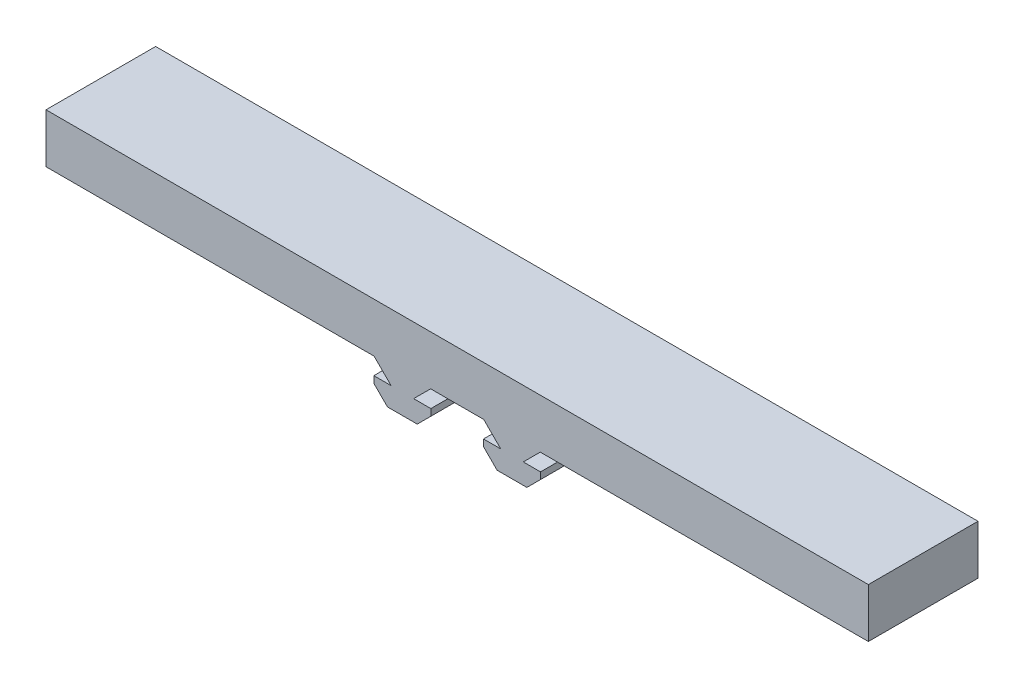
ISO-10303-21;
HEADER;
FILE_DESCRIPTION(('STEP AP214'),'2;1');
FILE_NAME('part.step','',(''),(''),'','','');
FILE_SCHEMA(('AUTOMOTIVE_DESIGN { 1 0 10303 214 1 1 1 1 }'));
ENDSEC;
DATA;
#1=APPLICATION_CONTEXT('core data for automotive mechanical design processes');
#2=APPLICATION_PROTOCOL_DEFINITION('international standard','automotive_design',2000,#1);
#3=PRODUCT_CONTEXT('',#1,'mechanical');
#4=PRODUCT('Part','Part','',(#3));
#5=PRODUCT_RELATED_PRODUCT_CATEGORY('part','',(#4));
#6=PRODUCT_DEFINITION_FORMATION('','',#4);
#7=PRODUCT_DEFINITION_CONTEXT('part definition',#1,'design');
#8=PRODUCT_DEFINITION('design','',#6,#7);
#9=PRODUCT_DEFINITION_SHAPE('','',#8);
#10=(LENGTH_UNIT() NAMED_UNIT(*) SI_UNIT(.MILLI.,.METRE.));
#11=(NAMED_UNIT(*) PLANE_ANGLE_UNIT() SI_UNIT($,.RADIAN.));
#12=(NAMED_UNIT(*) SI_UNIT($,.STERADIAN.) SOLID_ANGLE_UNIT());
#13=UNCERTAINTY_MEASURE_WITH_UNIT(LENGTH_MEASURE(1.E-05),#10,'distance_accuracy_value','');
#14=(GEOMETRIC_REPRESENTATION_CONTEXT(3) GLOBAL_UNCERTAINTY_ASSIGNED_CONTEXT((#13)) GLOBAL_UNIT_ASSIGNED_CONTEXT((#10,
#11,#12)) REPRESENTATION_CONTEXT('',''));
#15=CARTESIAN_POINT('',(0.,0.,0.));
#16=DIRECTION('',(0.,0.,1.));
#17=DIRECTION('',(1.,0.,0.));
#18=AXIS2_PLACEMENT_3D('',#15,#16,#17);
#19=CARTESIAN_POINT('',(-21.2929086217148,51.9989658510694,20.));
#20=DIRECTION('',(1.,0.,0.));
#21=DIRECTION('',(0.,0.,-1.));
#22=AXIS2_PLACEMENT_3D('',#19,#20,#21);
#23=PLANE('',#22);
#24=DIRECTION('',(0.,-1.,0.));
#25=VECTOR('',#24,1.);
#26=CARTESIAN_POINT('',(-21.2929086217148,51.9989658510694,0.));
#27=LINE('',#26,#25);
#28=CARTESIAN_POINT('',(-21.2929086217148,51.9989658510694,0.));
#29=VERTEX_POINT('',#28);
#30=CARTESIAN_POINT('',(-21.2929086217148,42.9989658510694,0.));
#31=VERTEX_POINT('',#30);
#32=EDGE_CURVE('E289',#29,#31,#27,.T.);
#33=ORIENTED_EDGE('',*,*,#32,.T.);
#34=DIRECTION('',(0.,0.,-1.));
#35=VECTOR('',#34,1.);
#36=CARTESIAN_POINT('',(-21.2929086217148,42.9989658510694,20.));
#37=LINE('',#36,#35);
#38=CARTESIAN_POINT('',(-21.2929086217148,42.9989658510694,20.));
#39=VERTEX_POINT('',#38);
#40=EDGE_CURVE('E12',#39,#31,#37,.T.);
#41=ORIENTED_EDGE('',*,*,#40,.F.);
#42=DIRECTION('',(0.,-1.,0.));
#43=VECTOR('',#42,1.);
#44=CARTESIAN_POINT('',(-21.2929086217148,51.9989658510694,20.));
#45=LINE('',#44,#43);
#46=CARTESIAN_POINT('',(-21.2929086217148,51.9989658510694,20.));
#47=VERTEX_POINT('',#46);
#48=EDGE_CURVE('E204',#47,#39,#45,.T.);
#49=ORIENTED_EDGE('',*,*,#48,.F.);
#50=DIRECTION('',(0.,0.,-1.));
#51=VECTOR('',#50,1.);
#52=CARTESIAN_POINT('',(-21.2929086217148,51.9989658510694,20.));
#53=LINE('',#52,#51);
#54=EDGE_CURVE('E306',#47,#29,#53,.T.);
#55=ORIENTED_EDGE('',*,*,#54,.T.);
#56=EDGE_LOOP('',(#33,#41,#49,#55));
#57=FACE_BOUND('',#56,.T.);
#58=ADVANCED_FACE('F41',(#57),#23,.F.);
#59=CARTESIAN_POINT('',(-21.2929086217148,42.9989658510694,20.));
#60=DIRECTION('',(0.,1.,0.));
#61=DIRECTION('',(0.,0.,1.));
#62=AXIS2_PLACEMENT_3D('',#59,#60,#61);
#63=PLANE('',#62);
#64=DIRECTION('',(1.,0.,0.));
#65=VECTOR('',#64,1.);
#66=CARTESIAN_POINT('',(-21.2929086217148,42.9989658510694,0.));
#67=LINE('',#66,#65);
#68=CARTESIAN_POINT('',(38.5513554469971,42.9989658510694,0.));
#69=VERTEX_POINT('',#68);
#70=EDGE_CURVE('E211',#31,#69,#67,.T.);
#71=ORIENTED_EDGE('',*,*,#70,.T.);
#72=DIRECTION('',(0.,0.,-1.));
#73=VECTOR('',#72,1.);
#74=CARTESIAN_POINT('',(38.5513554469971,42.9989658510694,20.));
#75=LINE('',#74,#73);
#76=CARTESIAN_POINT('',(38.5513554469971,42.9989658510694,20.));
#77=VERTEX_POINT('',#76);
#78=EDGE_CURVE('E45',#77,#69,#75,.T.);
#79=ORIENTED_EDGE('',*,*,#78,.F.);
#80=DIRECTION('',(1.,0.,0.));
#81=VECTOR('',#80,1.);
#82=CARTESIAN_POINT('',(-21.2929086217148,42.9989658510694,20.));
#83=LINE('',#82,#81);
#84=EDGE_CURVE('E197',#39,#77,#83,.T.);
#85=ORIENTED_EDGE('',*,*,#84,.F.);
#86=ORIENTED_EDGE('',*,*,#40,.T.);
#87=EDGE_LOOP('',(#71,#79,#85,#86));
#88=FACE_BOUND('',#87,.T.);
#89=ADVANCED_FACE('F210',(#88),#63,.F.);
#90=CARTESIAN_POINT('',(39.3392234126411,42.2110978854254,20.));
#91=DIRECTION('',(0.707106781186538,0.707106781186557,0.));
#92=DIRECTION('',(-0.707106781186557,0.707106781186538,0.));
#93=AXIS2_PLACEMENT_3D('',#90,#91,#92);
#94=PLANE('',#93);
#95=DIRECTION('',(0.707106781186557,-0.707106781186538,0.));
#96=VECTOR('',#95,1.);
#97=CARTESIAN_POINT('',(39.3392234126411,42.2110978854254,0.));
#98=LINE('',#97,#96);
#99=CARTESIAN_POINT('',(41.6513554469972,39.8989658510694,0.));
#100=VERTEX_POINT('',#99);
#101=EDGE_CURVE('E226',#69,#100,#98,.T.);
#102=ORIENTED_EDGE('',*,*,#101,.T.);
#103=DIRECTION('',(0.,0.,-1.));
#104=VECTOR('',#103,1.);
#105=CARTESIAN_POINT('',(41.6513554469972,39.8989658510694,20.));
#106=LINE('',#105,#104);
#107=CARTESIAN_POINT('',(41.6513554469972,39.8989658510694,20.));
#108=VERTEX_POINT('',#107);
#109=EDGE_CURVE('E215',#108,#100,#106,.T.);
#110=ORIENTED_EDGE('',*,*,#109,.F.);
#111=DIRECTION('',(0.707106781186557,-0.707106781186538,0.));
#112=VECTOR('',#111,1.);
#113=CARTESIAN_POINT('',(39.3392234126411,42.2110978854254,20.));
#114=LINE('',#113,#112);
#115=EDGE_CURVE('E201',#77,#108,#114,.T.);
#116=ORIENTED_EDGE('',*,*,#115,.F.);
#117=ORIENTED_EDGE('',*,*,#78,.T.);
#118=EDGE_LOOP('',(#102,#110,#116,#117));
#119=FACE_BOUND('',#118,.T.);
#120=ADVANCED_FACE('F216',(#119),#94,.F.);
#121=CARTESIAN_POINT('',(40.9270913782852,39.8989658510694,20.));
#122=DIRECTION('',(0.,-1.,0.));
#123=DIRECTION('',(0.,0.,-1.));
#124=AXIS2_PLACEMENT_3D('',#121,#122,#123);
#125=PLANE('',#124);
#126=DIRECTION('',(-1.,0.,0.));
#127=VECTOR('',#126,1.);
#128=CARTESIAN_POINT('',(40.9270913782852,39.8989658510694,0.));
#129=LINE('',#128,#127);
#130=CARTESIAN_POINT('',(38.5070913782852,39.8989658510694,0.));
#131=VERTEX_POINT('',#130);
#132=EDGE_CURVE('E292',#100,#131,#129,.T.);
#133=ORIENTED_EDGE('',*,*,#132,.T.);
#134=DIRECTION('',(0.,0.,-1.));
#135=VECTOR('',#134,1.);
#136=CARTESIAN_POINT('',(38.5070913782852,39.8989658510694,20.));
#137=LINE('',#136,#135);
#138=CARTESIAN_POINT('',(38.5070913782852,39.8989658510694,20.));
#139=VERTEX_POINT('',#138);
#140=EDGE_CURVE('E415',#139,#131,#137,.T.);
#141=ORIENTED_EDGE('',*,*,#140,.F.);
#142=DIRECTION('',(-1.,0.,0.));
#143=VECTOR('',#142,1.);
#144=CARTESIAN_POINT('',(40.9270913782852,39.8989658510694,20.));
#145=LINE('',#144,#143);
#146=EDGE_CURVE('E220',#108,#139,#145,.T.);
#147=ORIENTED_EDGE('',*,*,#146,.F.);
#148=ORIENTED_EDGE('',*,*,#109,.T.);
#149=EDGE_LOOP('',(#133,#141,#147,#148));
#150=FACE_BOUND('',#149,.T.);
#151=ADVANCED_FACE('F444',(#150),#125,.F.);
#152=CARTESIAN_POINT('',(38.5070913782852,40.1989658510694,20.));
#153=DIRECTION('',(1.,0.,0.));
#154=DIRECTION('',(0.,0.,-1.));
#155=AXIS2_PLACEMENT_3D('',#152,#153,#154);
#156=PLANE('',#155);
#157=DIRECTION('',(0.,-1.,0.));
#158=VECTOR('',#157,1.);
#159=CARTESIAN_POINT('',(38.5070913782852,40.1989658510694,0.));
#160=LINE('',#159,#158);
#161=CARTESIAN_POINT('',(38.5070913782852,38.6832299197814,0.));
#162=VERTEX_POINT('',#161);
#163=EDGE_CURVE('E438',#131,#162,#160,.T.);
#164=ORIENTED_EDGE('',*,*,#163,.T.);
#165=DIRECTION('',(0.,0.,-1.));
#166=VECTOR('',#165,1.);
#167=CARTESIAN_POINT('',(38.5070913782852,38.6832299197814,20.));
#168=LINE('',#167,#166);
#169=CARTESIAN_POINT('',(38.5070913782852,38.6832299197814,20.));
#170=VERTEX_POINT('',#169);
#171=EDGE_CURVE('E411',#170,#162,#168,.T.);
#172=ORIENTED_EDGE('',*,*,#171,.F.);
#173=DIRECTION('',(0.,-1.,0.));
#174=VECTOR('',#173,1.);
#175=CARTESIAN_POINT('',(38.5070913782852,40.1989658510694,20.));
#176=LINE('',#175,#174);
#177=EDGE_CURVE('E223',#139,#170,#176,.T.);
#178=ORIENTED_EDGE('',*,*,#177,.F.);
#179=ORIENTED_EDGE('',*,*,#140,.T.);
#180=EDGE_LOOP('',(#164,#172,#178,#179));
#181=FACE_BOUND('',#180,.T.);
#182=ADVANCED_FACE('F449',(#181),#156,.F.);
#183=CARTESIAN_POINT('',(38.4192234126411,38.7710978854254,20.));
#184=DIRECTION('',(0.707106781186538,0.707106781186557,0.));
#185=DIRECTION('',(-0.707106781186557,0.707106781186538,0.));
#186=AXIS2_PLACEMENT_3D('',#183,#184,#185);
#187=PLANE('',#186);
#188=DIRECTION('',(0.707106781186557,-0.707106781186538,0.));
#189=VECTOR('',#188,1.);
#190=CARTESIAN_POINT('',(38.4192234126411,38.7710978854254,0.));
#191=LINE('',#190,#189);
#192=CARTESIAN_POINT('',(40.9913554469971,36.1989658510694,0.));
#193=VERTEX_POINT('',#192);
#194=EDGE_CURVE('E435',#162,#193,#191,.T.);
#195=ORIENTED_EDGE('',*,*,#194,.T.);
#196=DIRECTION('',(0.,0.,-1.));
#197=VECTOR('',#196,1.);
#198=CARTESIAN_POINT('',(40.9913554469971,36.1989658510694,20.));
#199=LINE('',#198,#197);
#200=CARTESIAN_POINT('',(40.9913554469971,36.1989658510694,20.));
#201=VERTEX_POINT('',#200);
#202=EDGE_CURVE('E407',#201,#193,#199,.T.);
#203=ORIENTED_EDGE('',*,*,#202,.F.);
#204=DIRECTION('',(0.707106781186557,-0.707106781186538,0.));
#205=VECTOR('',#204,1.);
#206=CARTESIAN_POINT('',(38.4192234126411,38.7710978854254,20.));
#207=LINE('',#206,#205);
#208=EDGE_CURVE('E231',#170,#201,#207,.T.);
#209=ORIENTED_EDGE('',*,*,#208,.F.);
#210=ORIENTED_EDGE('',*,*,#171,.T.);
#211=EDGE_LOOP('',(#195,#203,#209,#210));
#212=FACE_BOUND('',#211,.T.);
#213=ADVANCED_FACE('F457',(#212),#187,.F.);
#214=CARTESIAN_POINT('',(40.8670913782852,36.1989658510694,20.));
#215=DIRECTION('',(0.,1.,0.));
#216=DIRECTION('',(0.,0.,1.));
#217=AXIS2_PLACEMENT_3D('',#214,#215,#216);
#218=PLANE('',#217);
#219=DIRECTION('',(1.,0.,0.));
#220=VECTOR('',#219,1.);
#221=CARTESIAN_POINT('',(40.8670913782852,36.1989658510694,0.));
#222=LINE('',#221,#220);
#223=CARTESIAN_POINT('',(46.4228273095732,36.1989658510694,0.));
#224=VERTEX_POINT('',#223);
#225=EDGE_CURVE('E432',#193,#224,#222,.T.);
#226=ORIENTED_EDGE('',*,*,#225,.T.);
#227=DIRECTION('',(0.,0.,-1.));
#228=VECTOR('',#227,1.);
#229=CARTESIAN_POINT('',(46.4228273095732,36.1989658510694,20.));
#230=LINE('',#229,#228);
#231=CARTESIAN_POINT('',(46.4228273095732,36.1989658510694,20.));
#232=VERTEX_POINT('',#231);
#233=EDGE_CURVE('E403',#232,#224,#230,.T.);
#234=ORIENTED_EDGE('',*,*,#233,.F.);
#235=DIRECTION('',(1.,0.,0.));
#236=VECTOR('',#235,1.);
#237=CARTESIAN_POINT('',(40.8670913782852,36.1989658510694,20.));
#238=LINE('',#237,#236);
#239=EDGE_CURVE('E234',#201,#232,#238,.T.);
#240=ORIENTED_EDGE('',*,*,#239,.F.);
#241=ORIENTED_EDGE('',*,*,#202,.T.);
#242=EDGE_LOOP('',(#226,#234,#240,#241));
#243=FACE_BOUND('',#242,.T.);
#244=ADVANCED_FACE('F461',(#243),#218,.F.);
#245=CARTESIAN_POINT('',(48.9949593439292,38.7710978854254,20.));
#246=DIRECTION('',(-0.707106781186539,0.707106781186556,0.));
#247=DIRECTION('',(-0.707106781186556,-0.707106781186539,0.));
#248=AXIS2_PLACEMENT_3D('',#245,#246,#247);
#249=PLANE('',#248);
#250=DIRECTION('',(0.707106781186556,0.707106781186539,0.));
#251=VECTOR('',#250,1.);
#252=CARTESIAN_POINT('',(48.9949593439292,38.7710978854254,0.));
#253=LINE('',#252,#251);
#254=CARTESIAN_POINT('',(48.9070913782852,38.6832299197814,0.));
#255=VERTEX_POINT('',#254);
#256=EDGE_CURVE('E429',#224,#255,#253,.T.);
#257=ORIENTED_EDGE('',*,*,#256,.T.);
#258=DIRECTION('',(0.,0.,-1.));
#259=VECTOR('',#258,1.);
#260=CARTESIAN_POINT('',(48.9070913782852,38.6832299197814,20.));
#261=LINE('',#260,#259);
#262=CARTESIAN_POINT('',(48.9070913782852,38.6832299197814,20.));
#263=VERTEX_POINT('',#262);
#264=EDGE_CURVE('E399',#263,#255,#261,.T.);
#265=ORIENTED_EDGE('',*,*,#264,.F.);
#266=DIRECTION('',(0.707106781186556,0.707106781186539,0.));
#267=VECTOR('',#266,1.);
#268=CARTESIAN_POINT('',(48.9949593439292,38.7710978854254,20.));
#269=LINE('',#268,#267);
#270=EDGE_CURVE('E237',#232,#263,#269,.T.);
#271=ORIENTED_EDGE('',*,*,#270,.F.);
#272=ORIENTED_EDGE('',*,*,#233,.T.);
#273=EDGE_LOOP('',(#257,#265,#271,#272));
#274=FACE_BOUND('',#273,.T.);
#275=ADVANCED_FACE('F468',(#274),#249,.F.);
#276=CARTESIAN_POINT('',(48.9070913782852,40.1989658510694,20.));
#277=DIRECTION('',(-1.,0.,0.));
#278=DIRECTION('',(0.,0.,1.));
#279=AXIS2_PLACEMENT_3D('',#276,#277,#278);
#280=PLANE('',#279);
#281=DIRECTION('',(0.,1.,0.));
#282=VECTOR('',#281,1.);
#283=CARTESIAN_POINT('',(48.9070913782852,40.1989658510694,0.));
#284=LINE('',#283,#282);
#285=CARTESIAN_POINT('',(48.9070913782852,39.8989658510694,0.));
#286=VERTEX_POINT('',#285);
#287=EDGE_CURVE('E426',#255,#286,#284,.T.);
#288=ORIENTED_EDGE('',*,*,#287,.T.);
#289=DIRECTION('',(0.,0.,-1.));
#290=VECTOR('',#289,1.);
#291=CARTESIAN_POINT('',(48.9070913782852,39.8989658510694,20.));
#292=LINE('',#291,#290);
#293=CARTESIAN_POINT('',(48.9070913782852,39.8989658510694,20.));
#294=VERTEX_POINT('',#293);
#295=EDGE_CURVE('E395',#294,#286,#292,.T.);
#296=ORIENTED_EDGE('',*,*,#295,.F.);
#297=DIRECTION('',(0.,1.,0.));
#298=VECTOR('',#297,1.);
#299=CARTESIAN_POINT('',(48.9070913782852,40.1989658510694,20.));
#300=LINE('',#299,#298);
#301=EDGE_CURVE('E240',#263,#294,#300,.T.);
#302=ORIENTED_EDGE('',*,*,#301,.F.);
#303=ORIENTED_EDGE('',*,*,#264,.T.);
#304=EDGE_LOOP('',(#288,#296,#302,#303));
#305=FACE_BOUND('',#304,.T.);
#306=ADVANCED_FACE('F471',(#305),#280,.F.);
#307=CARTESIAN_POINT('',(46.4870913782851,39.8989658510694,20.));
#308=DIRECTION('',(0.,-1.,0.));
#309=DIRECTION('',(1.,0.,0.));
#310=AXIS2_PLACEMENT_3D('',#307,#308,#309);
#311=PLANE('',#310);
#312=DIRECTION('',(-1.,0.,0.));
#313=VECTOR('',#312,1.);
#314=CARTESIAN_POINT('',(46.4870913782851,39.8989658510694,0.));
#315=LINE('',#314,#313);
#316=CARTESIAN_POINT('',(45.7628273095732,39.8989658510694,0.));
#317=VERTEX_POINT('',#316);
#318=EDGE_CURVE('E423',#286,#317,#315,.T.);
#319=ORIENTED_EDGE('',*,*,#318,.T.);
#320=DIRECTION('',(0.,0.,-1.));
#321=VECTOR('',#320,1.);
#322=CARTESIAN_POINT('',(45.7628273095732,39.8989658510694,20.));
#323=LINE('',#322,#321);
#324=CARTESIAN_POINT('',(45.7628273095732,39.8989658510694,20.));
#325=VERTEX_POINT('',#324);
#326=EDGE_CURVE('E259',#325,#317,#323,.T.);
#327=ORIENTED_EDGE('',*,*,#326,.F.);
#328=DIRECTION('',(-1.,0.,0.));
#329=VECTOR('',#328,1.);
#330=CARTESIAN_POINT('',(46.4870913782851,39.8989658510694,20.));
#331=LINE('',#330,#329);
#332=EDGE_CURVE('E243',#294,#325,#331,.T.);
#333=ORIENTED_EDGE('',*,*,#332,.F.);
#334=ORIENTED_EDGE('',*,*,#295,.T.);
#335=EDGE_LOOP('',(#319,#327,#333,#334));
#336=FACE_BOUND('',#335,.T.);
#337=ADVANCED_FACE('F476',(#336),#311,.F.);
#338=CARTESIAN_POINT('',(48.0749593439292,42.2110978854254,20.));
#339=DIRECTION('',(-0.707106781186539,0.707106781186556,0.));
#340=DIRECTION('',(-0.707106781186556,-0.707106781186539,0.));
#341=AXIS2_PLACEMENT_3D('',#338,#339,#340);
#342=PLANE('',#341);
#343=DIRECTION('',(0.707106781186556,0.707106781186539,0.));
#344=VECTOR('',#343,1.);
#345=CARTESIAN_POINT('',(48.0749593439292,42.2110978854254,0.));
#346=LINE('',#345,#344);
#347=CARTESIAN_POINT('',(48.8628273095733,42.9989658510694,0.));
#348=VERTEX_POINT('',#347);
#349=EDGE_CURVE('E254',#317,#348,#346,.T.);
#350=ORIENTED_EDGE('',*,*,#349,.T.);
#351=DIRECTION('',(0.,0.,-1.));
#352=VECTOR('',#351,1.);
#353=CARTESIAN_POINT('',(48.8628273095733,42.9989658510694,20.));
#354=LINE('',#353,#352);
#355=CARTESIAN_POINT('',(48.8628273095733,42.9989658510694,20.));
#356=VERTEX_POINT('',#355);
#357=EDGE_CURVE('E255',#356,#348,#354,.T.);
#358=ORIENTED_EDGE('',*,*,#357,.F.);
#359=DIRECTION('',(0.707106781186556,0.707106781186539,0.));
#360=VECTOR('',#359,1.);
#361=CARTESIAN_POINT('',(48.0749593439292,42.2110978854254,20.));
#362=LINE('',#361,#360);
#363=EDGE_CURVE('E246',#325,#356,#362,.T.);
#364=ORIENTED_EDGE('',*,*,#363,.F.);
#365=ORIENTED_EDGE('',*,*,#326,.T.);
#366=EDGE_LOOP('',(#350,#358,#364,#365));
#367=FACE_BOUND('',#366,.T.);
#368=ADVANCED_FACE('F482',(#367),#342,.F.);
#369=CARTESIAN_POINT('',(48.2870913782852,42.9989658510694,20.));
#370=DIRECTION('',(0.,1.,0.));
#371=DIRECTION('',(0.,0.,1.));
#372=AXIS2_PLACEMENT_3D('',#369,#370,#371);
#373=PLANE('',#372);
#374=DIRECTION('',(1.,0.,0.));
#375=VECTOR('',#374,1.);
#376=CARTESIAN_POINT('',(48.2870913782852,42.9989658510694,0.));
#377=LINE('',#376,#375);
#378=CARTESIAN_POINT('',(58.5513554469971,42.9989658510694,0.));
#379=VERTEX_POINT('',#378);
#380=EDGE_CURVE('E250',#348,#379,#377,.T.);
#381=ORIENTED_EDGE('',*,*,#380,.T.);
#382=DIRECTION('',(0.,0.,-1.));
#383=VECTOR('',#382,1.);
#384=CARTESIAN_POINT('',(58.5513554469971,42.9989658510694,20.));
#385=LINE('',#384,#383);
#386=CARTESIAN_POINT('',(58.5513554469971,42.9989658510694,20.));
#387=VERTEX_POINT('',#386);
#388=EDGE_CURVE('E260',#387,#379,#385,.T.);
#389=ORIENTED_EDGE('',*,*,#388,.F.);
#390=DIRECTION('',(1.,0.,0.));
#391=VECTOR('',#390,1.);
#392=CARTESIAN_POINT('',(48.2870913782852,42.9989658510694,20.));
#393=LINE('',#392,#391);
#394=EDGE_CURVE('E249',#356,#387,#393,.T.);
#395=ORIENTED_EDGE('',*,*,#394,.F.);
#396=ORIENTED_EDGE('',*,*,#357,.T.);
#397=EDGE_LOOP('',(#381,#389,#395,#396));
#398=FACE_BOUND('',#397,.T.);
#399=ADVANCED_FACE('F486',(#398),#373,.F.);
#400=CARTESIAN_POINT('',(59.3392234126411,42.2110978854254,20.));
#401=DIRECTION('',(0.707106781186539,0.707106781186556,0.));
#402=DIRECTION('',(-0.707106781186556,0.707106781186539,0.));
#403=AXIS2_PLACEMENT_3D('',#400,#401,#402);
#404=PLANE('',#403);
#405=DIRECTION('',(0.707106781186556,-0.707106781186539,0.));
#406=VECTOR('',#405,1.);
#407=CARTESIAN_POINT('',(59.3392234126411,42.2110978854254,0.));
#408=LINE('',#407,#406);
#409=CARTESIAN_POINT('',(61.6513554469972,39.8989658510694,0.));
#410=VERTEX_POINT('',#409);
#411=EDGE_CURVE('E253',#379,#410,#408,.T.);
#412=ORIENTED_EDGE('',*,*,#411,.T.);
#413=DIRECTION('',(0.,0.,-1.));
#414=VECTOR('',#413,1.);
#415=CARTESIAN_POINT('',(61.6513554469972,39.8989658510694,20.));
#416=LINE('',#415,#414);
#417=CARTESIAN_POINT('',(61.6513554469972,39.8989658510694,20.));
#418=VERTEX_POINT('',#417);
#419=EDGE_CURVE('E267',#418,#410,#416,.T.);
#420=ORIENTED_EDGE('',*,*,#419,.F.);
#421=DIRECTION('',(0.707106781186556,-0.707106781186539,0.));
#422=VECTOR('',#421,1.);
#423=CARTESIAN_POINT('',(59.3392234126411,42.2110978854254,20.));
#424=LINE('',#423,#422);
#425=EDGE_CURVE('E263',#387,#418,#424,.T.);
#426=ORIENTED_EDGE('',*,*,#425,.F.);
#427=ORIENTED_EDGE('',*,*,#388,.T.);
#428=EDGE_LOOP('',(#412,#420,#426,#427));
#429=FACE_BOUND('',#428,.T.);
#430=ADVANCED_FACE('F491',(#429),#404,.F.);
#431=CARTESIAN_POINT('',(60.9270913782852,39.8989658510694,20.));
#432=DIRECTION('',(0.,-1.,0.));
#433=DIRECTION('',(1.,0.,0.));
#434=AXIS2_PLACEMENT_3D('',#431,#432,#433);
#435=PLANE('',#434);
#436=DIRECTION('',(-1.,0.,0.));
#437=VECTOR('',#436,1.);
#438=CARTESIAN_POINT('',(60.9270913782852,39.8989658510694,0.));
#439=LINE('',#438,#437);
#440=CARTESIAN_POINT('',(58.5070913782852,39.8989658510694,0.));
#441=VERTEX_POINT('',#440);
#442=EDGE_CURVE('E360',#410,#441,#439,.T.);
#443=ORIENTED_EDGE('',*,*,#442,.T.);
#444=DIRECTION('',(0.,0.,-1.));
#445=VECTOR('',#444,1.);
#446=CARTESIAN_POINT('',(58.5070913782852,39.8989658510694,20.));
#447=LINE('',#446,#445);
#448=CARTESIAN_POINT('',(58.5070913782852,39.8989658510694,20.));
#449=VERTEX_POINT('',#448);
#450=EDGE_CURVE('E335',#449,#441,#447,.T.);
#451=ORIENTED_EDGE('',*,*,#450,.F.);
#452=DIRECTION('',(-1.,0.,0.));
#453=VECTOR('',#452,1.);
#454=CARTESIAN_POINT('',(60.9270913782852,39.8989658510694,20.));
#455=LINE('',#454,#453);
#456=EDGE_CURVE('E367',#418,#449,#455,.T.);
#457=ORIENTED_EDGE('',*,*,#456,.F.);
#458=ORIENTED_EDGE('',*,*,#419,.T.);
#459=EDGE_LOOP('',(#443,#451,#457,#458));
#460=FACE_BOUND('',#459,.T.);
#461=ADVANCED_FACE('F497',(#460),#435,.F.);
#462=CARTESIAN_POINT('',(58.5070913782852,40.1989658510694,20.));
#463=DIRECTION('',(1.,0.,0.));
#464=DIRECTION('',(0.,0.,-1.));
#465=AXIS2_PLACEMENT_3D('',#462,#463,#464);
#466=PLANE('',#465);
#467=DIRECTION('',(0.,-1.,0.));
#468=VECTOR('',#467,1.);
#469=CARTESIAN_POINT('',(58.5070913782852,40.1989658510694,0.));
#470=LINE('',#469,#468);
#471=CARTESIAN_POINT('',(58.5070913782852,38.6832299197814,0.));
#472=VERTEX_POINT('',#471);
#473=EDGE_CURVE('E357',#441,#472,#470,.T.);
#474=ORIENTED_EDGE('',*,*,#473,.T.);
#475=DIRECTION('',(0.,0.,-1.));
#476=VECTOR('',#475,1.);
#477=CARTESIAN_POINT('',(58.5070913782852,38.6832299197814,20.));
#478=LINE('',#477,#476);
#479=CARTESIAN_POINT('',(58.5070913782852,38.6832299197814,20.));
#480=VERTEX_POINT('',#479);
#481=EDGE_CURVE('E331',#480,#472,#478,.T.);
#482=ORIENTED_EDGE('',*,*,#481,.F.);
#483=DIRECTION('',(0.,-1.,0.));
#484=VECTOR('',#483,1.);
#485=CARTESIAN_POINT('',(58.5070913782852,40.1989658510694,20.));
#486=LINE('',#485,#484);
#487=EDGE_CURVE('E370',#449,#480,#486,.T.);
#488=ORIENTED_EDGE('',*,*,#487,.F.);
#489=ORIENTED_EDGE('',*,*,#450,.T.);
#490=EDGE_LOOP('',(#474,#482,#488,#489));
#491=FACE_BOUND('',#490,.T.);
#492=ADVANCED_FACE('F501',(#491),#466,.F.);
#493=CARTESIAN_POINT('',(58.4192234126411,38.7710978854254,20.));
#494=DIRECTION('',(0.707106781186539,0.707106781186556,0.));
#495=DIRECTION('',(-0.707106781186556,0.707106781186539,0.));
#496=AXIS2_PLACEMENT_3D('',#493,#494,#495);
#497=PLANE('',#496);
#498=DIRECTION('',(0.707106781186556,-0.707106781186539,0.));
#499=VECTOR('',#498,1.);
#500=CARTESIAN_POINT('',(58.4192234126411,38.7710978854254,0.));
#501=LINE('',#500,#499);
#502=CARTESIAN_POINT('',(60.9913554469972,36.1989658510694,0.));
#503=VERTEX_POINT('',#502);
#504=EDGE_CURVE('E354',#472,#503,#501,.T.);
#505=ORIENTED_EDGE('',*,*,#504,.T.);
#506=DIRECTION('',(0.,0.,-1.));
#507=VECTOR('',#506,1.);
#508=CARTESIAN_POINT('',(60.9913554469972,36.1989658510694,20.));
#509=LINE('',#508,#507);
#510=CARTESIAN_POINT('',(60.9913554469972,36.1989658510694,20.));
#511=VERTEX_POINT('',#510);
#512=EDGE_CURVE('E327',#511,#503,#509,.T.);
#513=ORIENTED_EDGE('',*,*,#512,.F.);
#514=DIRECTION('',(0.707106781186556,-0.707106781186539,0.));
#515=VECTOR('',#514,1.);
#516=CARTESIAN_POINT('',(58.4192234126411,38.7710978854254,20.));
#517=LINE('',#516,#515);
#518=EDGE_CURVE('E373',#480,#511,#517,.T.);
#519=ORIENTED_EDGE('',*,*,#518,.F.);
#520=ORIENTED_EDGE('',*,*,#481,.T.);
#521=EDGE_LOOP('',(#505,#513,#519,#520));
#522=FACE_BOUND('',#521,.T.);
#523=ADVANCED_FACE('F506',(#522),#497,.F.);
#524=CARTESIAN_POINT('',(66.5470913782851,36.1989658510694,20.));
#525=DIRECTION('',(0.,1.,0.));
#526=DIRECTION('',(0.,0.,1.));
#527=AXIS2_PLACEMENT_3D('',#524,#525,#526);
#528=PLANE('',#527);
#529=DIRECTION('',(1.,0.,0.));
#530=VECTOR('',#529,1.);
#531=CARTESIAN_POINT('',(66.5470913782851,36.1989658510694,0.));
#532=LINE('',#531,#530);
#533=CARTESIAN_POINT('',(66.4228273095732,36.1989658510694,0.));
#534=VERTEX_POINT('',#533);
#535=EDGE_CURVE('E351',#503,#534,#532,.T.);
#536=ORIENTED_EDGE('',*,*,#535,.T.);
#537=DIRECTION('',(0.,0.,-1.));
#538=VECTOR('',#537,1.);
#539=CARTESIAN_POINT('',(66.4228273095732,36.1989658510694,20.));
#540=LINE('',#539,#538);
#541=CARTESIAN_POINT('',(66.4228273095732,36.1989658510694,20.));
#542=VERTEX_POINT('',#541);
#543=EDGE_CURVE('E323',#542,#534,#540,.T.);
#544=ORIENTED_EDGE('',*,*,#543,.F.);
#545=DIRECTION('',(1.,0.,0.));
#546=VECTOR('',#545,1.);
#547=CARTESIAN_POINT('',(66.5470913782851,36.1989658510694,20.));
#548=LINE('',#547,#546);
#549=EDGE_CURVE('E376',#511,#542,#548,.T.);
#550=ORIENTED_EDGE('',*,*,#549,.F.);
#551=ORIENTED_EDGE('',*,*,#512,.T.);
#552=EDGE_LOOP('',(#536,#544,#550,#551));
#553=FACE_BOUND('',#552,.T.);
#554=ADVANCED_FACE('F512',(#553),#528,.F.);
#555=CARTESIAN_POINT('',(68.9949593439292,38.7710978854254,20.));
#556=DIRECTION('',(-0.707106781186539,0.707106781186556,0.));
#557=DIRECTION('',(-0.707106781186556,-0.707106781186539,0.));
#558=AXIS2_PLACEMENT_3D('',#555,#556,#557);
#559=PLANE('',#558);
#560=DIRECTION('',(0.707106781186556,0.707106781186539,0.));
#561=VECTOR('',#560,1.);
#562=CARTESIAN_POINT('',(68.9949593439292,38.7710978854254,0.));
#563=LINE('',#562,#561);
#564=CARTESIAN_POINT('',(68.9070913782852,38.6832299197814,0.));
#565=VERTEX_POINT('',#564);
#566=EDGE_CURVE('E348',#534,#565,#563,.T.);
#567=ORIENTED_EDGE('',*,*,#566,.T.);
#568=DIRECTION('',(0.,0.,-1.));
#569=VECTOR('',#568,1.);
#570=CARTESIAN_POINT('',(68.9070913782852,38.6832299197814,20.));
#571=LINE('',#570,#569);
#572=CARTESIAN_POINT('',(68.9070913782852,38.6832299197814,20.));
#573=VERTEX_POINT('',#572);
#574=EDGE_CURVE('E319',#573,#565,#571,.T.);
#575=ORIENTED_EDGE('',*,*,#574,.F.);
#576=DIRECTION('',(0.707106781186556,0.707106781186539,0.));
#577=VECTOR('',#576,1.);
#578=CARTESIAN_POINT('',(68.9949593439292,38.7710978854254,20.));
#579=LINE('',#578,#577);
#580=EDGE_CURVE('E379',#542,#573,#579,.T.);
#581=ORIENTED_EDGE('',*,*,#580,.F.);
#582=ORIENTED_EDGE('',*,*,#543,.T.);
#583=EDGE_LOOP('',(#567,#575,#581,#582));
#584=FACE_BOUND('',#583,.T.);
#585=ADVANCED_FACE('F516',(#584),#559,.F.);
#586=CARTESIAN_POINT('',(68.9070913782852,40.1989658510694,20.));
#587=DIRECTION('',(-1.,0.,0.));
#588=DIRECTION('',(0.,0.,1.));
#589=AXIS2_PLACEMENT_3D('',#586,#587,#588);
#590=PLANE('',#589);
#591=DIRECTION('',(0.,1.,0.));
#592=VECTOR('',#591,1.);
#593=CARTESIAN_POINT('',(68.9070913782852,40.1989658510694,0.));
#594=LINE('',#593,#592);
#595=CARTESIAN_POINT('',(68.9070913782852,39.8989658510694,0.));
#596=VERTEX_POINT('',#595);
#597=EDGE_CURVE('E345',#565,#596,#594,.T.);
#598=ORIENTED_EDGE('',*,*,#597,.T.);
#599=DIRECTION('',(0.,0.,-1.));
#600=VECTOR('',#599,1.);
#601=CARTESIAN_POINT('',(68.9070913782852,39.8989658510694,20.));
#602=LINE('',#601,#600);
#603=CARTESIAN_POINT('',(68.9070913782852,39.8989658510694,20.));
#604=VERTEX_POINT('',#603);
#605=EDGE_CURVE('E315',#604,#596,#602,.T.);
#606=ORIENTED_EDGE('',*,*,#605,.F.);
#607=DIRECTION('',(0.,1.,0.));
#608=VECTOR('',#607,1.);
#609=CARTESIAN_POINT('',(68.9070913782852,40.1989658510694,20.));
#610=LINE('',#609,#608);
#611=EDGE_CURVE('E382',#573,#604,#610,.T.);
#612=ORIENTED_EDGE('',*,*,#611,.F.);
#613=ORIENTED_EDGE('',*,*,#574,.T.);
#614=EDGE_LOOP('',(#598,#606,#612,#613));
#615=FACE_BOUND('',#614,.T.);
#616=ADVANCED_FACE('F521',(#615),#590,.F.);
#617=CARTESIAN_POINT('',(66.4870913782851,39.8989658510694,20.));
#618=DIRECTION('',(0.,-1.,0.));
#619=DIRECTION('',(1.,0.,0.));
#620=AXIS2_PLACEMENT_3D('',#617,#618,#619);
#621=PLANE('',#620);
#622=DIRECTION('',(-1.,0.,0.));
#623=VECTOR('',#622,1.);
#624=CARTESIAN_POINT('',(66.4870913782851,39.8989658510694,0.));
#625=LINE('',#624,#623);
#626=CARTESIAN_POINT('',(65.7628273095732,39.8989658510694,0.));
#627=VERTEX_POINT('',#626);
#628=EDGE_CURVE('E342',#596,#627,#625,.T.);
#629=ORIENTED_EDGE('',*,*,#628,.T.);
#630=DIRECTION('',(0.,0.,-1.));
#631=VECTOR('',#630,1.);
#632=CARTESIAN_POINT('',(65.7628273095732,39.8989658510694,20.));
#633=LINE('',#632,#631);
#634=CARTESIAN_POINT('',(65.7628273095732,39.8989658510694,20.));
#635=VERTEX_POINT('',#634);
#636=EDGE_CURVE('E277',#635,#627,#633,.T.);
#637=ORIENTED_EDGE('',*,*,#636,.F.);
#638=DIRECTION('',(-1.,0.,0.));
#639=VECTOR('',#638,1.);
#640=CARTESIAN_POINT('',(66.4870913782851,39.8989658510694,20.));
#641=LINE('',#640,#639);
#642=EDGE_CURVE('E385',#604,#635,#641,.T.);
#643=ORIENTED_EDGE('',*,*,#642,.F.);
#644=ORIENTED_EDGE('',*,*,#605,.T.);
#645=EDGE_LOOP('',(#629,#637,#643,#644));
#646=FACE_BOUND('',#645,.T.);
#647=ADVANCED_FACE('F527',(#646),#621,.F.);
#648=CARTESIAN_POINT('',(68.0749593439292,42.2110978854254,20.));
#649=DIRECTION('',(-0.707106781186539,0.707106781186556,0.));
#650=DIRECTION('',(-0.707106781186556,-0.707106781186539,0.));
#651=AXIS2_PLACEMENT_3D('',#648,#649,#650);
#652=PLANE('',#651);
#653=DIRECTION('',(0.707106781186556,0.707106781186539,0.));
#654=VECTOR('',#653,1.);
#655=CARTESIAN_POINT('',(68.0749593439292,42.2110978854254,0.));
#656=LINE('',#655,#654);
#657=CARTESIAN_POINT('',(68.8628273095733,42.9989658510694,0.));
#658=VERTEX_POINT('',#657);
#659=EDGE_CURVE('E272',#627,#658,#656,.T.);
#660=ORIENTED_EDGE('',*,*,#659,.T.);
#661=DIRECTION('',(0.,0.,-1.));
#662=VECTOR('',#661,1.);
#663=CARTESIAN_POINT('',(68.8628273095733,42.9989658510694,20.));
#664=LINE('',#663,#662);
#665=CARTESIAN_POINT('',(68.8628273095733,42.9989658510694,20.));
#666=VERTEX_POINT('',#665);
#667=EDGE_CURVE('E273',#666,#658,#664,.T.);
#668=ORIENTED_EDGE('',*,*,#667,.F.);
#669=DIRECTION('',(0.707106781186556,0.707106781186539,0.));
#670=VECTOR('',#669,1.);
#671=CARTESIAN_POINT('',(68.0749593439292,42.2110978854254,20.));
#672=LINE('',#671,#670);
#673=EDGE_CURVE('E283',#635,#666,#672,.T.);
#674=ORIENTED_EDGE('',*,*,#673,.F.);
#675=ORIENTED_EDGE('',*,*,#636,.T.);
#676=EDGE_LOOP('',(#660,#668,#674,#675));
#677=FACE_BOUND('',#676,.T.);
#678=ADVANCED_FACE('F531',(#677),#652,.F.);
#679=CARTESIAN_POINT('',(68.2870913782852,42.9989658510694,20.));
#680=DIRECTION('',(0.,1.,0.));
#681=DIRECTION('',(-1.,0.,0.));
#682=AXIS2_PLACEMENT_3D('',#679,#680,#681);
#683=PLANE('',#682);
#684=DIRECTION('',(1.,0.,0.));
#685=VECTOR('',#684,1.);
#686=CARTESIAN_POINT('',(68.2870913782852,42.9989658510694,0.));
#687=LINE('',#686,#685);
#688=CARTESIAN_POINT('',(128.707091378285,42.9989658510695,0.));
#689=VERTEX_POINT('',#688);
#690=EDGE_CURVE('E268',#658,#689,#687,.T.);
#691=ORIENTED_EDGE('',*,*,#690,.T.);
#692=DIRECTION('',(0.,0.,-1.));
#693=VECTOR('',#692,1.);
#694=CARTESIAN_POINT('',(128.707091378285,42.9989658510695,20.));
#695=LINE('',#694,#693);
#696=CARTESIAN_POINT('',(128.707091378285,42.9989658510695,20.));
#697=VERTEX_POINT('',#696);
#698=EDGE_CURVE('E278',#697,#689,#695,.T.);
#699=ORIENTED_EDGE('',*,*,#698,.F.);
#700=DIRECTION('',(1.,0.,0.));
#701=VECTOR('',#700,1.);
#702=CARTESIAN_POINT('',(68.2870913782852,42.9989658510694,20.));
#703=LINE('',#702,#701);
#704=EDGE_CURVE('E279',#666,#697,#703,.T.);
#705=ORIENTED_EDGE('',*,*,#704,.F.);
#706=ORIENTED_EDGE('',*,*,#667,.T.);
#707=EDGE_LOOP('',(#691,#699,#705,#706));
#708=FACE_BOUND('',#707,.T.);
#709=ADVANCED_FACE('F43',(#708),#683,.F.);
#710=CARTESIAN_POINT('',(128.707091378285,51.9989658510695,20.));
#711=DIRECTION('',(-1.,0.,0.));
#712=DIRECTION('',(0.,-1.,0.));
#713=AXIS2_PLACEMENT_3D('',#710,#711,#712);
#714=PLANE('',#713);
#715=DIRECTION('',(0.,1.,0.));
#716=VECTOR('',#715,1.);
#717=CARTESIAN_POINT('',(128.707091378285,51.9989658510695,0.));
#718=LINE('',#717,#716);
#719=CARTESIAN_POINT('',(128.707091378285,51.9989658510695,0.));
#720=VERTEX_POINT('',#719);
#721=EDGE_CURVE('E271',#689,#720,#718,.T.);
#722=ORIENTED_EDGE('',*,*,#721,.T.);
#723=DIRECTION('',(0.,0.,-1.));
#724=VECTOR('',#723,1.);
#725=CARTESIAN_POINT('',(128.707091378285,51.9989658510695,20.));
#726=LINE('',#725,#724);
#727=CARTESIAN_POINT('',(128.707091378285,51.9989658510695,20.));
#728=VERTEX_POINT('',#727);
#729=EDGE_CURVE('E287',#728,#720,#726,.T.);
#730=ORIENTED_EDGE('',*,*,#729,.F.);
#731=DIRECTION('',(0.,1.,0.));
#732=VECTOR('',#731,1.);
#733=CARTESIAN_POINT('',(128.707091378285,51.9989658510695,20.));
#734=LINE('',#733,#732);
#735=EDGE_CURVE('E282',#697,#728,#734,.T.);
#736=ORIENTED_EDGE('',*,*,#735,.F.);
#737=ORIENTED_EDGE('',*,*,#698,.T.);
#738=EDGE_LOOP('',(#722,#730,#736,#737));
#739=FACE_BOUND('',#738,.T.);
#740=ADVANCED_FACE('F540',(#739),#714,.F.);
#741=CARTESIAN_POINT('',(-21.2929086217148,51.9989658510694,20.));
#742=DIRECTION('',(0.,-1.,0.));
#743=DIRECTION('',(1.,0.,0.));
#744=AXIS2_PLACEMENT_3D('',#741,#742,#743);
#745=PLANE('',#744);
#746=DIRECTION('',(-1.,0.,0.));
#747=VECTOR('',#746,1.);
#748=CARTESIAN_POINT('',(-21.2929086217148,51.9989658510694,0.));
#749=LINE('',#748,#747);
#750=EDGE_CURVE('E303',#720,#29,#749,.T.);
#751=ORIENTED_EDGE('',*,*,#750,.T.);
#752=ORIENTED_EDGE('',*,*,#54,.F.);
#753=DIRECTION('',(-1.,0.,0.));
#754=VECTOR('',#753,1.);
#755=CARTESIAN_POINT('',(-21.2929086217148,51.9989658510694,20.));
#756=LINE('',#755,#754);
#757=EDGE_CURVE('E60',#728,#47,#756,.T.);
#758=ORIENTED_EDGE('',*,*,#757,.F.);
#759=ORIENTED_EDGE('',*,*,#729,.T.);
#760=EDGE_LOOP('',(#751,#752,#758,#759));
#761=FACE_BOUND('',#760,.T.);
#762=ADVANCED_FACE('F544',(#761),#745,.F.);
#763=CARTESIAN_POINT('',(0.,0.,20.));
#764=DIRECTION('',(0.,0.,1.));
#765=DIRECTION('',(1.,0.,0.));
#766=AXIS2_PLACEMENT_3D('',#763,#764,#765);
#767=PLANE('',#766);
#768=ORIENTED_EDGE('',*,*,#48,.T.);
#769=ORIENTED_EDGE('',*,*,#84,.T.);
#770=ORIENTED_EDGE('',*,*,#115,.T.);
#771=ORIENTED_EDGE('',*,*,#146,.T.);
#772=ORIENTED_EDGE('',*,*,#177,.T.);
#773=ORIENTED_EDGE('',*,*,#208,.T.);
#774=ORIENTED_EDGE('',*,*,#239,.T.);
#775=ORIENTED_EDGE('',*,*,#270,.T.);
#776=ORIENTED_EDGE('',*,*,#301,.T.);
#777=ORIENTED_EDGE('',*,*,#332,.T.);
#778=ORIENTED_EDGE('',*,*,#363,.T.);
#779=ORIENTED_EDGE('',*,*,#394,.T.);
#780=ORIENTED_EDGE('',*,*,#425,.T.);
#781=ORIENTED_EDGE('',*,*,#456,.T.);
#782=ORIENTED_EDGE('',*,*,#487,.T.);
#783=ORIENTED_EDGE('',*,*,#518,.T.);
#784=ORIENTED_EDGE('',*,*,#549,.T.);
#785=ORIENTED_EDGE('',*,*,#580,.T.);
#786=ORIENTED_EDGE('',*,*,#611,.T.);
#787=ORIENTED_EDGE('',*,*,#642,.T.);
#788=ORIENTED_EDGE('',*,*,#673,.T.);
#789=ORIENTED_EDGE('',*,*,#704,.T.);
#790=ORIENTED_EDGE('',*,*,#735,.T.);
#791=ORIENTED_EDGE('',*,*,#757,.T.);
#792=EDGE_LOOP('',(#768,#769,#770,#771,#772,#773,#774,#775,#776,#777,#778,#779,#780,#781,#782,
#783,#784,#785,#786,#787,#788,#789,#790,#791));
#793=FACE_BOUND('',#792,.T.);
#794=ADVANCED_FACE('F199',(#793),#767,.T.);
#795=CARTESIAN_POINT('',(0.,0.,0.));
#796=DIRECTION('',(0.,0.,1.));
#797=DIRECTION('',(1.,0.,0.));
#798=AXIS2_PLACEMENT_3D('',#795,#796,#797);
#799=PLANE('',#798);
#800=ORIENTED_EDGE('',*,*,#32,.F.);
#801=ORIENTED_EDGE('',*,*,#750,.F.);
#802=ORIENTED_EDGE('',*,*,#721,.F.);
#803=ORIENTED_EDGE('',*,*,#690,.F.);
#804=ORIENTED_EDGE('',*,*,#659,.F.);
#805=ORIENTED_EDGE('',*,*,#628,.F.);
#806=ORIENTED_EDGE('',*,*,#597,.F.);
#807=ORIENTED_EDGE('',*,*,#566,.F.);
#808=ORIENTED_EDGE('',*,*,#535,.F.);
#809=ORIENTED_EDGE('',*,*,#504,.F.);
#810=ORIENTED_EDGE('',*,*,#473,.F.);
#811=ORIENTED_EDGE('',*,*,#442,.F.);
#812=ORIENTED_EDGE('',*,*,#411,.F.);
#813=ORIENTED_EDGE('',*,*,#380,.F.);
#814=ORIENTED_EDGE('',*,*,#349,.F.);
#815=ORIENTED_EDGE('',*,*,#318,.F.);
#816=ORIENTED_EDGE('',*,*,#287,.F.);
#817=ORIENTED_EDGE('',*,*,#256,.F.);
#818=ORIENTED_EDGE('',*,*,#225,.F.);
#819=ORIENTED_EDGE('',*,*,#194,.F.);
#820=ORIENTED_EDGE('',*,*,#163,.F.);
#821=ORIENTED_EDGE('',*,*,#132,.F.);
#822=ORIENTED_EDGE('',*,*,#101,.F.);
#823=ORIENTED_EDGE('',*,*,#70,.F.);
#824=EDGE_LOOP('',(#800,#801,#802,#803,#804,#805,#806,#807,#808,#809,#810,#811,#812,#813,#814,
#815,#816,#817,#818,#819,#820,#821,#822,#823));
#825=FACE_BOUND('',#824,.T.);
#826=ADVANCED_FACE('F452',(#825),#799,.F.);
#827=CLOSED_SHELL('',(#58,#89,#120,#151,#182,#213,#244,#275,#306,#337,#368,#399,#430,#461,#492,
#523,#554,#585,#616,#647,#678,#709,#740,#762,#794,#826));
#828=MANIFOLD_SOLID_BREP('B2',#827);
#829=ADVANCED_BREP_SHAPE_REPRESENTATION('',(#18,#828),#14);
#830=SHAPE_DEFINITION_REPRESENTATION(#9,#829);
ENDSEC;
END-ISO-10303-21;
